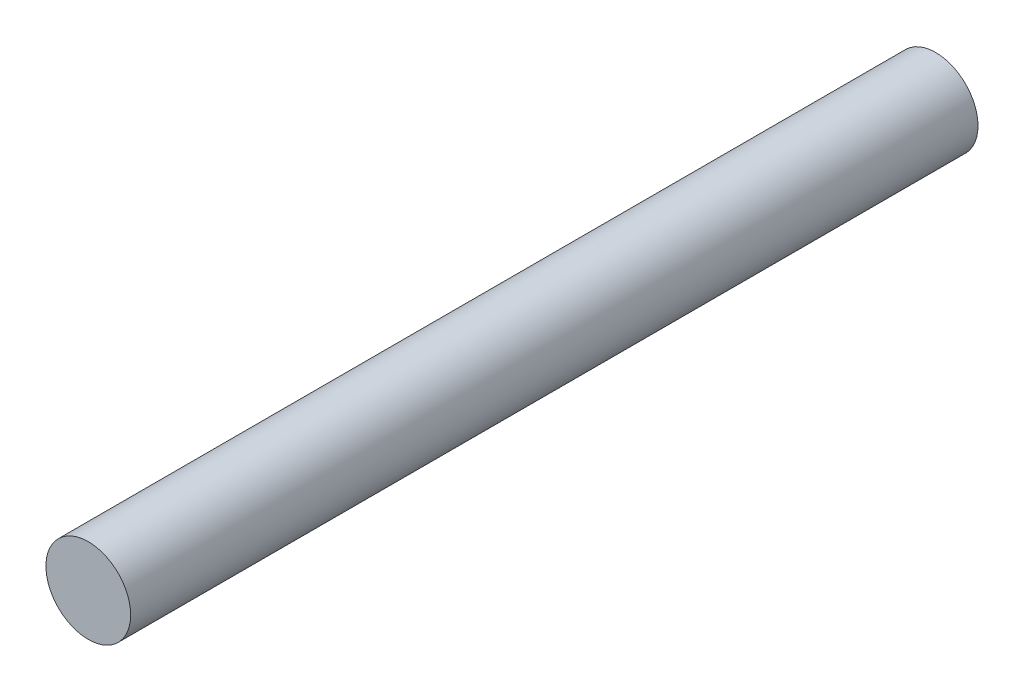
ISO-10303-21;
HEADER;
FILE_DESCRIPTION(('STEP AP214'),'2;1');
FILE_NAME('part.step','',(''),(''),'','','');
FILE_SCHEMA(('AUTOMOTIVE_DESIGN { 1 0 10303 214 1 1 1 1 }'));
ENDSEC;
DATA;
#1=APPLICATION_CONTEXT('core data for automotive mechanical design processes');
#2=APPLICATION_PROTOCOL_DEFINITION('international standard','automotive_design',2000,#1);
#3=PRODUCT_CONTEXT('',#1,'mechanical');
#4=PRODUCT('Part','Part','',(#3));
#5=PRODUCT_RELATED_PRODUCT_CATEGORY('part','',(#4));
#6=PRODUCT_DEFINITION_FORMATION('','',#4);
#7=PRODUCT_DEFINITION_CONTEXT('part definition',#1,'design');
#8=PRODUCT_DEFINITION('design','',#6,#7);
#9=PRODUCT_DEFINITION_SHAPE('','',#8);
#10=(LENGTH_UNIT() NAMED_UNIT(*) SI_UNIT(.MILLI.,.METRE.));
#11=(NAMED_UNIT(*) PLANE_ANGLE_UNIT() SI_UNIT($,.RADIAN.));
#12=(NAMED_UNIT(*) SI_UNIT($,.STERADIAN.) SOLID_ANGLE_UNIT());
#13=UNCERTAINTY_MEASURE_WITH_UNIT(LENGTH_MEASURE(1.E-05),#10,'distance_accuracy_value','');
#14=(GEOMETRIC_REPRESENTATION_CONTEXT(3) GLOBAL_UNCERTAINTY_ASSIGNED_CONTEXT((#13)) GLOBAL_UNIT_ASSIGNED_CONTEXT((#10,
#11,#12)) REPRESENTATION_CONTEXT('',''));
#15=CARTESIAN_POINT('',(0.,0.,0.));
#16=DIRECTION('',(0.,0.,1.));
#17=DIRECTION('',(1.,0.,0.));
#18=AXIS2_PLACEMENT_3D('',#15,#16,#17);
#19=CARTESIAN_POINT('',(0.,0.,20.));
#20=DIRECTION('',(0.,0.,-1.));
#21=DIRECTION('',(-1.,0.,0.));
#22=AXIS2_PLACEMENT_3D('',#19,#20,#21);
#23=CYLINDRICAL_SURFACE('',#22,1.);
#24=CARTESIAN_POINT('',(0.,0.,20.));
#25=DIRECTION('',(0.,0.,1.));
#26=DIRECTION('',(1.,0.,0.));
#27=AXIS2_PLACEMENT_3D('',#24,#25,#26);
#28=CIRCLE('',#27,1.);
#29=CARTESIAN_POINT('',(1.,0.,20.));
#30=VERTEX_POINT('',#29);
#31=EDGE_CURVE('E10',#30,#30,#28,.T.);
#32=ORIENTED_EDGE('',*,*,#31,.F.);
#33=EDGE_LOOP('',(#32));
#34=FACE_BOUND('',#33,.T.);
#35=CARTESIAN_POINT('',(0.,0.,0.));
#36=DIRECTION('',(0.,0.,1.));
#37=DIRECTION('',(1.,0.,0.));
#38=AXIS2_PLACEMENT_3D('',#35,#36,#37);
#39=CIRCLE('',#38,1.);
#40=CARTESIAN_POINT('',(1.,0.,0.));
#41=VERTEX_POINT('',#40);
#42=EDGE_CURVE('E46',#41,#41,#39,.T.);
#43=ORIENTED_EDGE('',*,*,#42,.T.);
#44=EDGE_LOOP('',(#43));
#45=FACE_BOUND('',#44,.T.);
#46=ADVANCED_FACE('F43',(#34,#45),#23,.T.);
#47=CARTESIAN_POINT('',(0.,0.,20.));
#48=DIRECTION('',(0.,0.,1.));
#49=DIRECTION('',(1.,0.,0.));
#50=AXIS2_PLACEMENT_3D('',#47,#48,#49);
#51=PLANE('',#50);
#52=ORIENTED_EDGE('',*,*,#31,.T.);
#53=EDGE_LOOP('',(#52));
#54=FACE_BOUND('',#53,.T.);
#55=ADVANCED_FACE('F60',(#54),#51,.T.);
#56=CARTESIAN_POINT('',(0.,0.,0.));
#57=DIRECTION('',(0.,0.,1.));
#58=DIRECTION('',(1.,0.,0.));
#59=AXIS2_PLACEMENT_3D('',#56,#57,#58);
#60=PLANE('',#59);
#61=ORIENTED_EDGE('',*,*,#42,.F.);
#62=EDGE_LOOP('',(#61));
#63=FACE_BOUND('',#62,.T.);
#64=ADVANCED_FACE('F58',(#63),#60,.F.);
#65=CLOSED_SHELL('',(#46,#55,#64));
#66=MANIFOLD_SOLID_BREP('B2',#65);
#67=ADVANCED_BREP_SHAPE_REPRESENTATION('',(#18,#66),#14);
#68=SHAPE_DEFINITION_REPRESENTATION(#9,#67);
ENDSEC;
END-ISO-10303-21;
